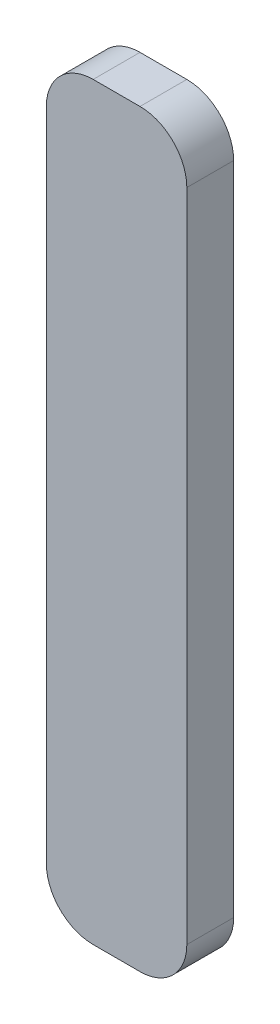
ISO-10303-21;
HEADER;
FILE_DESCRIPTION(('STEP AP214'),'2;1');
FILE_NAME('part.step','',(''),(''),'','','');
FILE_SCHEMA(('AUTOMOTIVE_DESIGN { 1 0 10303 214 1 1 1 1 }'));
ENDSEC;
DATA;
#1=APPLICATION_CONTEXT('core data for automotive mechanical design processes');
#2=APPLICATION_PROTOCOL_DEFINITION('international standard','automotive_design',2000,#1);
#3=PRODUCT_CONTEXT('',#1,'mechanical');
#4=PRODUCT('Part','Part','',(#3));
#5=PRODUCT_RELATED_PRODUCT_CATEGORY('part','',(#4));
#6=PRODUCT_DEFINITION_FORMATION('','',#4);
#7=PRODUCT_DEFINITION_CONTEXT('part definition',#1,'design');
#8=PRODUCT_DEFINITION('design','',#6,#7);
#9=PRODUCT_DEFINITION_SHAPE('','',#8);
#10=(LENGTH_UNIT() NAMED_UNIT(*) SI_UNIT(.MILLI.,.METRE.));
#11=(NAMED_UNIT(*) PLANE_ANGLE_UNIT() SI_UNIT($,.RADIAN.));
#12=(NAMED_UNIT(*) SI_UNIT($,.STERADIAN.) SOLID_ANGLE_UNIT());
#13=UNCERTAINTY_MEASURE_WITH_UNIT(LENGTH_MEASURE(1.E-05),#10,'distance_accuracy_value','');
#14=(GEOMETRIC_REPRESENTATION_CONTEXT(3) GLOBAL_UNCERTAINTY_ASSIGNED_CONTEXT((#13)) GLOBAL_UNIT_ASSIGNED_CONTEXT((#10,
#11,#12)) REPRESENTATION_CONTEXT('',''));
#15=CARTESIAN_POINT('',(0.,0.,0.));
#16=DIRECTION('',(0.,0.,1.));
#17=DIRECTION('',(1.,0.,0.));
#18=AXIS2_PLACEMENT_3D('',#15,#16,#17);
#19=CARTESIAN_POINT('',(0.,0.,10.));
#20=DIRECTION('',(1.,0.,0.));
#21=DIRECTION('',(0.,0.,-1.));
#22=AXIS2_PLACEMENT_3D('',#19,#20,#21);
#23=PLANE('',#22);
#24=DIRECTION('',(0.,-1.,0.));
#25=VECTOR('',#24,1.);
#26=CARTESIAN_POINT('',(0.,0.,0.));
#27=LINE('',#26,#25);
#28=CARTESIAN_POINT('',(0.,150.,0.));
#29=VERTEX_POINT('',#28);
#30=CARTESIAN_POINT('',(0.,10.,0.));
#31=VERTEX_POINT('',#30);
#32=EDGE_CURVE('E130',#29,#31,#27,.T.);
#33=ORIENTED_EDGE('',*,*,#32,.T.);
#34=DIRECTION('',(0.,0.,-1.));
#35=VECTOR('',#34,1.);
#36=CARTESIAN_POINT('',(0.,10.,10.));
#37=LINE('',#36,#35);
#38=CARTESIAN_POINT('',(0.,10.,10.));
#39=VERTEX_POINT('',#38);
#40=EDGE_CURVE('E152',#31,#39,#37,.F.);
#41=ORIENTED_EDGE('',*,*,#40,.T.);
#42=DIRECTION('',(0.,-1.,0.));
#43=VECTOR('',#42,1.);
#44=CARTESIAN_POINT('',(0.,0.,10.));
#45=LINE('',#44,#43);
#46=CARTESIAN_POINT('',(0.,150.,10.));
#47=VERTEX_POINT('',#46);
#48=EDGE_CURVE('E128',#47,#39,#45,.T.);
#49=ORIENTED_EDGE('',*,*,#48,.F.);
#50=DIRECTION('',(0.,0.,-1.));
#51=VECTOR('',#50,1.);
#52=CARTESIAN_POINT('',(0.,150.,10.));
#53=LINE('',#52,#51);
#54=EDGE_CURVE('E149',#47,#29,#53,.T.);
#55=ORIENTED_EDGE('',*,*,#54,.T.);
#56=EDGE_LOOP('',(#33,#41,#49,#55));
#57=FACE_BOUND('',#56,.T.);
#58=ADVANCED_FACE('F33',(#57),#23,.F.);
#59=CARTESIAN_POINT('',(0.,0.,10.));
#60=DIRECTION('',(0.,1.,0.));
#61=DIRECTION('',(0.,0.,1.));
#62=AXIS2_PLACEMENT_3D('',#59,#60,#61);
#63=PLANE('',#62);
#64=DIRECTION('',(1.,0.,0.));
#65=VECTOR('',#64,1.);
#66=CARTESIAN_POINT('',(0.,0.,0.));
#67=LINE('',#66,#65);
#68=CARTESIAN_POINT('',(10.,0.,0.));
#69=VERTEX_POINT('',#68);
#70=CARTESIAN_POINT('',(20.,0.,0.));
#71=VERTEX_POINT('',#70);
#72=EDGE_CURVE('E126',#69,#71,#67,.T.);
#73=ORIENTED_EDGE('',*,*,#72,.T.);
#74=DIRECTION('',(0.,0.,-1.));
#75=VECTOR('',#74,1.);
#76=CARTESIAN_POINT('',(20.,0.,10.));
#77=LINE('',#76,#75);
#78=CARTESIAN_POINT('',(20.,0.,10.));
#79=VERTEX_POINT('',#78);
#80=EDGE_CURVE('E104',#71,#79,#77,.F.);
#81=ORIENTED_EDGE('',*,*,#80,.T.);
#82=DIRECTION('',(1.,0.,0.));
#83=VECTOR('',#82,1.);
#84=CARTESIAN_POINT('',(0.,0.,10.));
#85=LINE('',#84,#83);
#86=CARTESIAN_POINT('',(10.,0.,10.));
#87=VERTEX_POINT('',#86);
#88=EDGE_CURVE('E166',#87,#79,#85,.T.);
#89=ORIENTED_EDGE('',*,*,#88,.F.);
#90=DIRECTION('',(0.,0.,-1.));
#91=VECTOR('',#90,1.);
#92=CARTESIAN_POINT('',(10.,0.,10.));
#93=LINE('',#92,#91);
#94=EDGE_CURVE('E109',#87,#69,#93,.T.);
#95=ORIENTED_EDGE('',*,*,#94,.T.);
#96=EDGE_LOOP('',(#73,#81,#89,#95));
#97=FACE_BOUND('',#96,.T.);
#98=ADVANCED_FACE('F171',(#97),#63,.F.);
#99=CARTESIAN_POINT('',(30.,0.,10.));
#100=DIRECTION('',(-1.,0.,0.));
#101=DIRECTION('',(0.,0.,1.));
#102=AXIS2_PLACEMENT_3D('',#99,#100,#101);
#103=PLANE('',#102);
#104=DIRECTION('',(0.,1.,0.));
#105=VECTOR('',#104,1.);
#106=CARTESIAN_POINT('',(30.,0.,10.));
#107=LINE('',#106,#105);
#108=CARTESIAN_POINT('',(30.,10.,10.));
#109=VERTEX_POINT('',#108);
#110=CARTESIAN_POINT('',(30.,150.,10.));
#111=VERTEX_POINT('',#110);
#112=EDGE_CURVE('E118',#109,#111,#107,.T.);
#113=ORIENTED_EDGE('',*,*,#112,.F.);
#114=DIRECTION('',(0.,0.,-1.));
#115=VECTOR('',#114,1.);
#116=CARTESIAN_POINT('',(30.,10.,10.));
#117=LINE('',#116,#115);
#118=CARTESIAN_POINT('',(30.,10.,0.));
#119=VERTEX_POINT('',#118);
#120=EDGE_CURVE('E103',#109,#119,#117,.T.);
#121=ORIENTED_EDGE('',*,*,#120,.T.);
#122=DIRECTION('',(0.,1.,0.));
#123=VECTOR('',#122,1.);
#124=CARTESIAN_POINT('',(30.,0.,0.));
#125=LINE('',#124,#123);
#126=CARTESIAN_POINT('',(30.,150.,0.));
#127=VERTEX_POINT('',#126);
#128=EDGE_CURVE('E116',#119,#127,#125,.T.);
#129=ORIENTED_EDGE('',*,*,#128,.T.);
#130=DIRECTION('',(0.,0.,-1.));
#131=VECTOR('',#130,1.);
#132=CARTESIAN_POINT('',(30.,150.,10.));
#133=LINE('',#132,#131);
#134=EDGE_CURVE('E120',#127,#111,#133,.F.);
#135=ORIENTED_EDGE('',*,*,#134,.T.);
#136=EDGE_LOOP('',(#113,#121,#129,#135));
#137=FACE_BOUND('',#136,.T.);
#138=ADVANCED_FACE('F115',(#137),#103,.F.);
#139=CARTESIAN_POINT('',(0.,160.,10.));
#140=DIRECTION('',(0.,-1.,0.));
#141=DIRECTION('',(0.,0.,-1.));
#142=AXIS2_PLACEMENT_3D('',#139,#140,#141);
#143=PLANE('',#142);
#144=DIRECTION('',(-1.,0.,0.));
#145=VECTOR('',#144,1.);
#146=CARTESIAN_POINT('',(0.,160.,10.));
#147=LINE('',#146,#145);
#148=CARTESIAN_POINT('',(20.,160.,10.));
#149=VERTEX_POINT('',#148);
#150=CARTESIAN_POINT('',(10.,160.,10.));
#151=VERTEX_POINT('',#150);
#152=EDGE_CURVE('E134',#149,#151,#147,.T.);
#153=ORIENTED_EDGE('',*,*,#152,.F.);
#154=DIRECTION('',(0.,0.,-1.));
#155=VECTOR('',#154,1.);
#156=CARTESIAN_POINT('',(20.,160.,10.));
#157=LINE('',#156,#155);
#158=CARTESIAN_POINT('',(20.,160.,0.));
#159=VERTEX_POINT('',#158);
#160=EDGE_CURVE('E11',#149,#159,#157,.T.);
#161=ORIENTED_EDGE('',*,*,#160,.T.);
#162=DIRECTION('',(-1.,0.,0.));
#163=VECTOR('',#162,1.);
#164=CARTESIAN_POINT('',(0.,160.,0.));
#165=LINE('',#164,#163);
#166=CARTESIAN_POINT('',(10.,160.,0.));
#167=VERTEX_POINT('',#166);
#168=EDGE_CURVE('E125',#159,#167,#165,.T.);
#169=ORIENTED_EDGE('',*,*,#168,.T.);
#170=DIRECTION('',(0.,0.,-1.));
#171=VECTOR('',#170,1.);
#172=CARTESIAN_POINT('',(10.,160.,10.));
#173=LINE('',#172,#171);
#174=EDGE_CURVE('E41',#167,#151,#173,.F.);
#175=ORIENTED_EDGE('',*,*,#174,.T.);
#176=EDGE_LOOP('',(#153,#161,#169,#175));
#177=FACE_BOUND('',#176,.T.);
#178=ADVANCED_FACE('F178',(#177),#143,.F.);
#179=CARTESIAN_POINT('',(0.,0.,10.));
#180=DIRECTION('',(0.,0.,-1.));
#181=DIRECTION('',(-1.,0.,0.));
#182=AXIS2_PLACEMENT_3D('',#179,#180,#181);
#183=PLANE('',#182);
#184=ORIENTED_EDGE('',*,*,#88,.T.);
#185=CARTESIAN_POINT('',(20.,10.,10.));
#186=DIRECTION('',(0.,0.,-1.));
#187=DIRECTION('',(-1.,0.,0.));
#188=AXIS2_PLACEMENT_3D('',#185,#186,#187);
#189=CIRCLE('',#188,10.);
#190=EDGE_CURVE('E147',#79,#109,#189,.F.);
#191=ORIENTED_EDGE('',*,*,#190,.T.);
#192=ORIENTED_EDGE('',*,*,#112,.T.);
#193=CARTESIAN_POINT('',(20.,150.,10.));
#194=DIRECTION('',(0.,0.,-1.));
#195=DIRECTION('',(-1.,0.,0.));
#196=AXIS2_PLACEMENT_3D('',#193,#194,#195);
#197=CIRCLE('',#196,10.);
#198=EDGE_CURVE('E54',#111,#149,#197,.F.);
#199=ORIENTED_EDGE('',*,*,#198,.T.);
#200=ORIENTED_EDGE('',*,*,#152,.T.);
#201=CARTESIAN_POINT('',(10.,150.,10.));
#202=DIRECTION('',(0.,0.,-1.));
#203=DIRECTION('',(-1.,0.,0.));
#204=AXIS2_PLACEMENT_3D('',#201,#202,#203);
#205=CIRCLE('',#204,10.);
#206=EDGE_CURVE('E142',#151,#47,#205,.F.);
#207=ORIENTED_EDGE('',*,*,#206,.T.);
#208=ORIENTED_EDGE('',*,*,#48,.T.);
#209=CARTESIAN_POINT('',(10.,10.,10.));
#210=DIRECTION('',(0.,0.,-1.));
#211=DIRECTION('',(-1.,0.,0.));
#212=AXIS2_PLACEMENT_3D('',#209,#210,#211);
#213=CIRCLE('',#212,10.);
#214=EDGE_CURVE('E145',#39,#87,#213,.F.);
#215=ORIENTED_EDGE('',*,*,#214,.T.);
#216=EDGE_LOOP('',(#184,#191,#192,#199,#200,#207,#208,#215));
#217=FACE_BOUND('',#216,.T.);
#218=ADVANCED_FACE('F163',(#217),#183,.F.);
#219=CARTESIAN_POINT('',(0.,0.,0.));
#220=DIRECTION('',(0.,0.,-1.));
#221=DIRECTION('',(-1.,0.,0.));
#222=AXIS2_PLACEMENT_3D('',#219,#220,#221);
#223=PLANE('',#222);
#224=ORIENTED_EDGE('',*,*,#128,.F.);
#225=CARTESIAN_POINT('',(20.,10.,0.));
#226=DIRECTION('',(0.,0.,-1.));
#227=DIRECTION('',(-1.,0.,0.));
#228=AXIS2_PLACEMENT_3D('',#225,#226,#227);
#229=CIRCLE('',#228,10.);
#230=EDGE_CURVE('E99',#119,#71,#229,.T.);
#231=ORIENTED_EDGE('',*,*,#230,.T.);
#232=ORIENTED_EDGE('',*,*,#72,.F.);
#233=CARTESIAN_POINT('',(10.,10.,0.));
#234=DIRECTION('',(0.,0.,-1.));
#235=DIRECTION('',(-1.,0.,0.));
#236=AXIS2_PLACEMENT_3D('',#233,#234,#235);
#237=CIRCLE('',#236,10.);
#238=EDGE_CURVE('E110',#69,#31,#237,.T.);
#239=ORIENTED_EDGE('',*,*,#238,.T.);
#240=ORIENTED_EDGE('',*,*,#32,.F.);
#241=CARTESIAN_POINT('',(10.,150.,0.));
#242=DIRECTION('',(0.,0.,-1.));
#243=DIRECTION('',(-1.,0.,0.));
#244=AXIS2_PLACEMENT_3D('',#241,#242,#243);
#245=CIRCLE('',#244,10.);
#246=EDGE_CURVE('E119',#29,#167,#245,.T.);
#247=ORIENTED_EDGE('',*,*,#246,.T.);
#248=ORIENTED_EDGE('',*,*,#168,.F.);
#249=CARTESIAN_POINT('',(20.,150.,0.));
#250=DIRECTION('',(0.,0.,-1.));
#251=DIRECTION('',(-1.,0.,0.));
#252=AXIS2_PLACEMENT_3D('',#249,#250,#251);
#253=CIRCLE('',#252,10.);
#254=EDGE_CURVE('E124',#159,#127,#253,.T.);
#255=ORIENTED_EDGE('',*,*,#254,.T.);
#256=EDGE_LOOP('',(#224,#231,#232,#239,#240,#247,#248,#255));
#257=FACE_BOUND('',#256,.T.);
#258=ADVANCED_FACE('F122',(#257),#223,.T.);
#259=CARTESIAN_POINT('',(20.,10.,10.));
#260=DIRECTION('',(0.,0.,-1.));
#261=DIRECTION('',(-1.,0.,0.));
#262=AXIS2_PLACEMENT_3D('',#259,#260,#261);
#263=CYLINDRICAL_SURFACE('',#262,10.);
#264=ORIENTED_EDGE('',*,*,#190,.F.);
#265=ORIENTED_EDGE('',*,*,#80,.F.);
#266=ORIENTED_EDGE('',*,*,#230,.F.);
#267=ORIENTED_EDGE('',*,*,#120,.F.);
#268=EDGE_LOOP('',(#264,#265,#266,#267));
#269=FACE_BOUND('',#268,.T.);
#270=ADVANCED_FACE('F102',(#269),#263,.T.);
#271=CARTESIAN_POINT('',(10.,10.,10.));
#272=DIRECTION('',(0.,0.,-1.));
#273=DIRECTION('',(-1.,0.,0.));
#274=AXIS2_PLACEMENT_3D('',#271,#272,#273);
#275=CYLINDRICAL_SURFACE('',#274,10.);
#276=ORIENTED_EDGE('',*,*,#214,.F.);
#277=ORIENTED_EDGE('',*,*,#40,.F.);
#278=ORIENTED_EDGE('',*,*,#238,.F.);
#279=ORIENTED_EDGE('',*,*,#94,.F.);
#280=EDGE_LOOP('',(#276,#277,#278,#279));
#281=FACE_BOUND('',#280,.T.);
#282=ADVANCED_FACE('F169',(#281),#275,.T.);
#283=CARTESIAN_POINT('',(20.,150.,10.));
#284=DIRECTION('',(0.,0.,-1.));
#285=DIRECTION('',(-1.,0.,0.));
#286=AXIS2_PLACEMENT_3D('',#283,#284,#285);
#287=CYLINDRICAL_SURFACE('',#286,10.);
#288=ORIENTED_EDGE('',*,*,#198,.F.);
#289=ORIENTED_EDGE('',*,*,#134,.F.);
#290=ORIENTED_EDGE('',*,*,#254,.F.);
#291=ORIENTED_EDGE('',*,*,#160,.F.);
#292=EDGE_LOOP('',(#288,#289,#290,#291));
#293=FACE_BOUND('',#292,.T.);
#294=ADVANCED_FACE('F177',(#293),#287,.T.);
#295=CARTESIAN_POINT('',(10.,150.,10.));
#296=DIRECTION('',(0.,0.,-1.));
#297=DIRECTION('',(-1.,0.,0.));
#298=AXIS2_PLACEMENT_3D('',#295,#296,#297);
#299=CYLINDRICAL_SURFACE('',#298,10.);
#300=ORIENTED_EDGE('',*,*,#206,.F.);
#301=ORIENTED_EDGE('',*,*,#174,.F.);
#302=ORIENTED_EDGE('',*,*,#246,.F.);
#303=ORIENTED_EDGE('',*,*,#54,.F.);
#304=EDGE_LOOP('',(#300,#301,#302,#303));
#305=FACE_BOUND('',#304,.T.);
#306=ADVANCED_FACE('F35',(#305),#299,.T.);
#307=CLOSED_SHELL('',(#58,#98,#138,#178,#218,#258,#270,#282,#294,#306));
#308=MANIFOLD_SOLID_BREP('B2',#307);
#309=ADVANCED_BREP_SHAPE_REPRESENTATION('',(#18,#308),#14);
#310=SHAPE_DEFINITION_REPRESENTATION(#9,#309);
ENDSEC;
END-ISO-10303-21;
